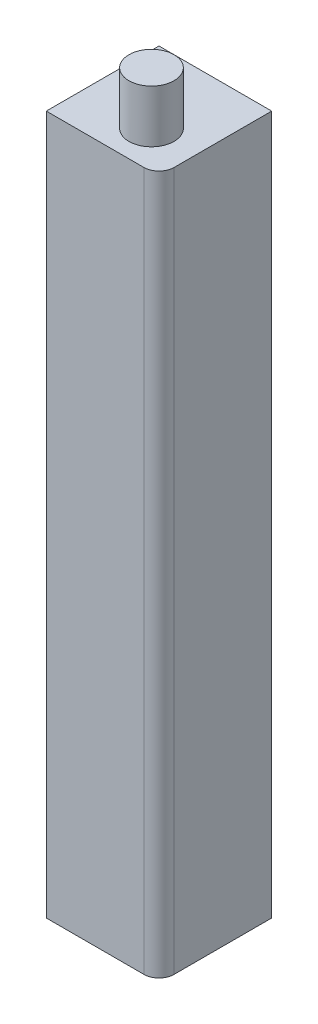
ISO-10303-21;
HEADER;
FILE_DESCRIPTION(('STEP AP214'),'2;1');
FILE_NAME('part.step','',(''),(''),'','','');
FILE_SCHEMA(('AUTOMOTIVE_DESIGN { 1 0 10303 214 1 1 1 1 }'));
ENDSEC;
DATA;
#1=APPLICATION_CONTEXT('core data for automotive mechanical design processes');
#2=APPLICATION_PROTOCOL_DEFINITION('international standard','automotive_design',2000,#1);
#3=PRODUCT_CONTEXT('',#1,'mechanical');
#4=PRODUCT('Part','Part','',(#3));
#5=PRODUCT_RELATED_PRODUCT_CATEGORY('part','',(#4));
#6=PRODUCT_DEFINITION_FORMATION('','',#4);
#7=PRODUCT_DEFINITION_CONTEXT('part definition',#1,'design');
#8=PRODUCT_DEFINITION('design','',#6,#7);
#9=PRODUCT_DEFINITION_SHAPE('','',#8);
#10=(LENGTH_UNIT() NAMED_UNIT(*) SI_UNIT(.MILLI.,.METRE.));
#11=(NAMED_UNIT(*) PLANE_ANGLE_UNIT() SI_UNIT($,.RADIAN.));
#12=(NAMED_UNIT(*) SI_UNIT($,.STERADIAN.) SOLID_ANGLE_UNIT());
#13=UNCERTAINTY_MEASURE_WITH_UNIT(LENGTH_MEASURE(1.E-05),#10,'distance_accuracy_value','');
#14=(GEOMETRIC_REPRESENTATION_CONTEXT(3) GLOBAL_UNCERTAINTY_ASSIGNED_CONTEXT((#13)) GLOBAL_UNIT_ASSIGNED_CONTEXT((#10,
#11,#12)) REPRESENTATION_CONTEXT('',''));
#15=CARTESIAN_POINT('',(0.,0.,0.));
#16=DIRECTION('',(0.,0.,1.));
#17=DIRECTION('',(1.,0.,0.));
#18=AXIS2_PLACEMENT_3D('',#15,#16,#17);
#19=CARTESIAN_POINT('',(7.5,93.,7.5));
#20=DIRECTION('',(-1.,0.,0.));
#21=DIRECTION('',(0.,0.,1.));
#22=AXIS2_PLACEMENT_3D('',#19,#20,#21);
#23=PLANE('',#22);
#24=DIRECTION('',(0.,0.,-1.));
#25=VECTOR('',#24,1.);
#26=CARTESIAN_POINT('',(7.5,93.,7.5));
#27=LINE('',#26,#25);
#28=CARTESIAN_POINT('',(7.5,93.,5.5));
#29=VERTEX_POINT('',#28);
#30=CARTESIAN_POINT('',(7.5,93.,-7.5));
#31=VERTEX_POINT('',#30);
#32=EDGE_CURVE('E78',#29,#31,#27,.T.);
#33=ORIENTED_EDGE('',*,*,#32,.F.);
#34=DIRECTION('',(0.,-1.,0.));
#35=VECTOR('',#34,1.);
#36=CARTESIAN_POINT('',(7.5,93.,5.5));
#37=LINE('',#36,#35);
#38=CARTESIAN_POINT('',(7.5,0.,5.5));
#39=VERTEX_POINT('',#38);
#40=EDGE_CURVE('E104',#29,#39,#37,.T.);
#41=ORIENTED_EDGE('',*,*,#40,.T.);
#42=DIRECTION('',(0.,0.,-1.));
#43=VECTOR('',#42,1.);
#44=CARTESIAN_POINT('',(7.5,0.,7.5));
#45=LINE('',#44,#43);
#46=CARTESIAN_POINT('',(7.5,0.,-7.5));
#47=VERTEX_POINT('',#46);
#48=EDGE_CURVE('E99',#39,#47,#45,.T.);
#49=ORIENTED_EDGE('',*,*,#48,.T.);
#50=DIRECTION('',(0.,-1.,0.));
#51=VECTOR('',#50,1.);
#52=CARTESIAN_POINT('',(7.5,93.,-7.5));
#53=LINE('',#52,#51);
#54=EDGE_CURVE('E93',#31,#47,#53,.T.);
#55=ORIENTED_EDGE('',*,*,#54,.F.);
#56=EDGE_LOOP('',(#33,#41,#49,#55));
#57=FACE_BOUND('',#56,.T.);
#58=ADVANCED_FACE('F32',(#57),#23,.F.);
#59=CARTESIAN_POINT('',(-7.5,93.,-7.5));
#60=DIRECTION('',(0.,0.,1.));
#61=DIRECTION('',(1.,0.,0.));
#62=AXIS2_PLACEMENT_3D('',#59,#60,#61);
#63=PLANE('',#62);
#64=DIRECTION('',(-1.,0.,0.));
#65=VECTOR('',#64,1.);
#66=CARTESIAN_POINT('',(-7.5,0.,-7.5));
#67=LINE('',#66,#65);
#68=CARTESIAN_POINT('',(-7.5,0.,-7.5));
#69=VERTEX_POINT('',#68);
#70=EDGE_CURVE('E114',#47,#69,#67,.T.);
#71=ORIENTED_EDGE('',*,*,#70,.T.);
#72=DIRECTION('',(0.,-1.,0.));
#73=VECTOR('',#72,1.);
#74=CARTESIAN_POINT('',(-7.5,93.,-7.5));
#75=LINE('',#74,#73);
#76=CARTESIAN_POINT('',(-7.5,93.,-7.5));
#77=VERTEX_POINT('',#76);
#78=EDGE_CURVE('E95',#77,#69,#75,.T.);
#79=ORIENTED_EDGE('',*,*,#78,.F.);
#80=DIRECTION('',(-1.,0.,0.));
#81=VECTOR('',#80,1.);
#82=CARTESIAN_POINT('',(-7.5,93.,-7.5));
#83=LINE('',#82,#81);
#84=EDGE_CURVE('E81',#31,#77,#83,.T.);
#85=ORIENTED_EDGE('',*,*,#84,.F.);
#86=ORIENTED_EDGE('',*,*,#54,.T.);
#87=EDGE_LOOP('',(#71,#79,#85,#86));
#88=FACE_BOUND('',#87,.T.);
#89=ADVANCED_FACE('F92',(#88),#63,.F.);
#90=CARTESIAN_POINT('',(-7.5,93.,7.5));
#91=DIRECTION('',(1.,0.,0.));
#92=DIRECTION('',(0.,0.,-1.));
#93=AXIS2_PLACEMENT_3D('',#90,#91,#92);
#94=PLANE('',#93);
#95=DIRECTION('',(0.,0.,1.));
#96=VECTOR('',#95,1.);
#97=CARTESIAN_POINT('',(-7.5,0.,7.5));
#98=LINE('',#97,#96);
#99=CARTESIAN_POINT('',(-7.5,0.,7.5));
#100=VERTEX_POINT('',#99);
#101=EDGE_CURVE('E117',#69,#100,#98,.T.);
#102=ORIENTED_EDGE('',*,*,#101,.T.);
#103=DIRECTION('',(0.,-1.,0.));
#104=VECTOR('',#103,1.);
#105=CARTESIAN_POINT('',(-7.5,93.,7.5));
#106=LINE('',#105,#104);
#107=CARTESIAN_POINT('',(-7.5,93.,7.5));
#108=VERTEX_POINT('',#107);
#109=EDGE_CURVE('E106',#108,#100,#106,.T.);
#110=ORIENTED_EDGE('',*,*,#109,.F.);
#111=DIRECTION('',(0.,0.,1.));
#112=VECTOR('',#111,1.);
#113=CARTESIAN_POINT('',(-7.5,93.,7.5));
#114=LINE('',#113,#112);
#115=EDGE_CURVE('E97',#77,#108,#114,.T.);
#116=ORIENTED_EDGE('',*,*,#115,.F.);
#117=ORIENTED_EDGE('',*,*,#78,.T.);
#118=EDGE_LOOP('',(#102,#110,#116,#117));
#119=FACE_BOUND('',#118,.T.);
#120=ADVANCED_FACE('F129',(#119),#94,.F.);
#121=CARTESIAN_POINT('',(-7.5,93.,7.5));
#122=DIRECTION('',(0.,0.,-1.));
#123=DIRECTION('',(-1.,0.,0.));
#124=AXIS2_PLACEMENT_3D('',#121,#122,#123);
#125=PLANE('',#124);
#126=DIRECTION('',(1.,0.,0.));
#127=VECTOR('',#126,1.);
#128=CARTESIAN_POINT('',(-7.5,0.,7.5));
#129=LINE('',#128,#127);
#130=CARTESIAN_POINT('',(5.49999999999999,0.,7.5));
#131=VERTEX_POINT('',#130);
#132=EDGE_CURVE('E88',#100,#131,#129,.T.);
#133=ORIENTED_EDGE('',*,*,#132,.T.);
#134=DIRECTION('',(0.,-1.,0.));
#135=VECTOR('',#134,1.);
#136=CARTESIAN_POINT('',(5.5,93.,7.5));
#137=LINE('',#136,#135);
#138=CARTESIAN_POINT('',(5.49999999999999,93.,7.5));
#139=VERTEX_POINT('',#138);
#140=EDGE_CURVE('E40',#131,#139,#137,.F.);
#141=ORIENTED_EDGE('',*,*,#140,.T.);
#142=DIRECTION('',(1.,0.,0.));
#143=VECTOR('',#142,1.);
#144=CARTESIAN_POINT('',(-7.5,93.,7.5));
#145=LINE('',#144,#143);
#146=EDGE_CURVE('E122',#108,#139,#145,.T.);
#147=ORIENTED_EDGE('',*,*,#146,.F.);
#148=ORIENTED_EDGE('',*,*,#109,.T.);
#149=EDGE_LOOP('',(#133,#141,#147,#148));
#150=FACE_BOUND('',#149,.T.);
#151=ADVANCED_FACE('F130',(#150),#125,.F.);
#152=CARTESIAN_POINT('',(0.,93.,0.));
#153=DIRECTION('',(0.,-1.,0.));
#154=DIRECTION('',(0.,0.,-1.));
#155=AXIS2_PLACEMENT_3D('',#152,#153,#154);
#156=PLANE('',#155);
#157=CARTESIAN_POINT('',(1.5,93.,2.5));
#158=DIRECTION('',(0.,-1.,0.));
#159=DIRECTION('',(0.,0.,-1.));
#160=AXIS2_PLACEMENT_3D('',#157,#158,#159);
#161=CIRCLE('',#160,3.);
#162=CARTESIAN_POINT('',(1.5,93.,-0.5));
#163=VERTEX_POINT('',#162);
#164=EDGE_CURVE('E101',#163,#163,#161,.F.);
#165=ORIENTED_EDGE('',*,*,#164,.F.);
#166=EDGE_LOOP('',(#165));
#167=FACE_BOUND('',#166,.T.);
#168=ORIENTED_EDGE('',*,*,#146,.T.);
#169=CARTESIAN_POINT('',(5.5,93.,5.5));
#170=DIRECTION('',(0.,-1.,0.));
#171=DIRECTION('',(0.,0.,-1.));
#172=AXIS2_PLACEMENT_3D('',#169,#170,#171);
#173=CIRCLE('',#172,2.);
#174=EDGE_CURVE('E11',#139,#29,#173,.F.);
#175=ORIENTED_EDGE('',*,*,#174,.T.);
#176=ORIENTED_EDGE('',*,*,#32,.T.);
#177=ORIENTED_EDGE('',*,*,#84,.T.);
#178=ORIENTED_EDGE('',*,*,#115,.T.);
#179=EDGE_LOOP('',(#168,#175,#176,#177,#178));
#180=FACE_BOUND('',#179,.T.);
#181=ADVANCED_FACE('F80',(#167,#180),#156,.F.);
#182=CARTESIAN_POINT('',(0.,0.,0.));
#183=DIRECTION('',(0.,-1.,0.));
#184=DIRECTION('',(0.,0.,-1.));
#185=AXIS2_PLACEMENT_3D('',#182,#183,#184);
#186=PLANE('',#185);
#187=ORIENTED_EDGE('',*,*,#48,.F.);
#188=CARTESIAN_POINT('',(5.5,0.,5.5));
#189=DIRECTION('',(0.,-1.,0.));
#190=DIRECTION('',(0.,0.,-1.));
#191=AXIS2_PLACEMENT_3D('',#188,#189,#190);
#192=CIRCLE('',#191,2.);
#193=EDGE_CURVE('E54',#39,#131,#192,.T.);
#194=ORIENTED_EDGE('',*,*,#193,.T.);
#195=ORIENTED_EDGE('',*,*,#132,.F.);
#196=ORIENTED_EDGE('',*,*,#101,.F.);
#197=ORIENTED_EDGE('',*,*,#70,.F.);
#198=EDGE_LOOP('',(#187,#194,#195,#196,#197));
#199=FACE_BOUND('',#198,.T.);
#200=ADVANCED_FACE('F112',(#199),#186,.T.);
#201=CARTESIAN_POINT('',(1.5,100.,2.5));
#202=DIRECTION('',(0.,-1.,0.));
#203=DIRECTION('',(0.,0.,-1.));
#204=AXIS2_PLACEMENT_3D('',#201,#202,#203);
#205=CYLINDRICAL_SURFACE('',#204,3.);
#206=CARTESIAN_POINT('',(1.5,100.,2.5));
#207=DIRECTION('',(0.,1.,0.));
#208=DIRECTION('',(0.,0.,1.));
#209=AXIS2_PLACEMENT_3D('',#206,#207,#208);
#210=CIRCLE('',#209,3.);
#211=CARTESIAN_POINT('',(1.5,100.,5.5));
#212=VERTEX_POINT('',#211);
#213=EDGE_CURVE('E115',#212,#212,#210,.T.);
#214=ORIENTED_EDGE('',*,*,#213,.F.);
#215=EDGE_LOOP('',(#214));
#216=FACE_BOUND('',#215,.T.);
#217=ORIENTED_EDGE('',*,*,#164,.T.);
#218=EDGE_LOOP('',(#217));
#219=FACE_BOUND('',#218,.T.);
#220=ADVANCED_FACE('F158',(#216,#219),#205,.T.);
#221=CARTESIAN_POINT('',(1.5,100.,2.5));
#222=DIRECTION('',(0.,1.,0.));
#223=DIRECTION('',(0.,0.,1.));
#224=AXIS2_PLACEMENT_3D('',#221,#222,#223);
#225=PLANE('',#224);
#226=ORIENTED_EDGE('',*,*,#213,.T.);
#227=EDGE_LOOP('',(#226));
#228=FACE_BOUND('',#227,.T.);
#229=ADVANCED_FACE('F163',(#228),#225,.T.);
#230=CARTESIAN_POINT('',(5.5,93.,5.5));
#231=DIRECTION('',(0.,-1.,0.));
#232=DIRECTION('',(0.,0.,-1.));
#233=AXIS2_PLACEMENT_3D('',#230,#231,#232);
#234=CYLINDRICAL_SURFACE('',#233,2.);
#235=ORIENTED_EDGE('',*,*,#174,.F.);
#236=ORIENTED_EDGE('',*,*,#140,.F.);
#237=ORIENTED_EDGE('',*,*,#193,.F.);
#238=ORIENTED_EDGE('',*,*,#40,.F.);
#239=EDGE_LOOP('',(#235,#236,#237,#238));
#240=FACE_BOUND('',#239,.T.);
#241=ADVANCED_FACE('F34',(#240),#234,.T.);
#242=CLOSED_SHELL('',(#58,#89,#120,#151,#181,#200,#220,#229,#241));
#243=MANIFOLD_SOLID_BREP('B2',#242);
#244=ADVANCED_BREP_SHAPE_REPRESENTATION('',(#18,#243),#14);
#245=SHAPE_DEFINITION_REPRESENTATION(#9,#244);
ENDSEC;
END-ISO-10303-21;
